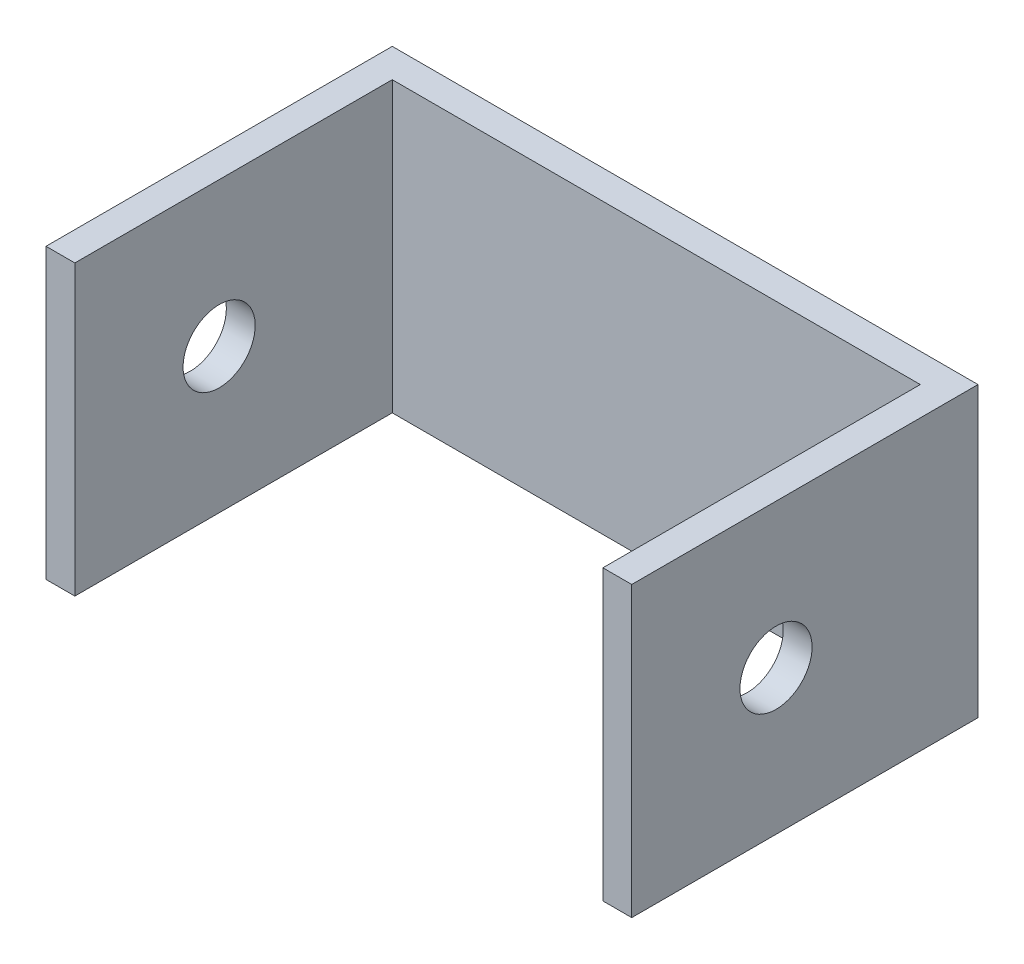
ISO-10303-21;
HEADER;
FILE_DESCRIPTION(('STEP AP214'),'2;1');
FILE_NAME('part.step','',(''),(''),'','','');
FILE_SCHEMA(('AUTOMOTIVE_DESIGN { 1 0 10303 214 1 1 1 1 }'));
ENDSEC;
DATA;
#1=APPLICATION_CONTEXT('core data for automotive mechanical design processes');
#2=APPLICATION_PROTOCOL_DEFINITION('international standard','automotive_design',2000,#1);
#3=PRODUCT_CONTEXT('',#1,'mechanical');
#4=PRODUCT('Part','Part','',(#3));
#5=PRODUCT_RELATED_PRODUCT_CATEGORY('part','',(#4));
#6=PRODUCT_DEFINITION_FORMATION('','',#4);
#7=PRODUCT_DEFINITION_CONTEXT('part definition',#1,'design');
#8=PRODUCT_DEFINITION('design','',#6,#7);
#9=PRODUCT_DEFINITION_SHAPE('','',#8);
#10=(LENGTH_UNIT() NAMED_UNIT(*) SI_UNIT(.MILLI.,.METRE.));
#11=(NAMED_UNIT(*) PLANE_ANGLE_UNIT() SI_UNIT($,.RADIAN.));
#12=(NAMED_UNIT(*) SI_UNIT($,.STERADIAN.) SOLID_ANGLE_UNIT());
#13=UNCERTAINTY_MEASURE_WITH_UNIT(LENGTH_MEASURE(1.E-05),#10,'distance_accuracy_value','');
#14=(GEOMETRIC_REPRESENTATION_CONTEXT(3) GLOBAL_UNCERTAINTY_ASSIGNED_CONTEXT((#13)) GLOBAL_UNIT_ASSIGNED_CONTEXT((#10,
#11,#12)) REPRESENTATION_CONTEXT('',''));
#15=CARTESIAN_POINT('',(0.,0.,0.));
#16=DIRECTION('',(0.,0.,1.));
#17=DIRECTION('',(1.,0.,0.));
#18=AXIS2_PLACEMENT_3D('',#15,#16,#17);
#19=CARTESIAN_POINT('',(0.,0.,2.));
#20=DIRECTION('',(0.,0.,1.));
#21=DIRECTION('',(1.,0.,0.));
#22=AXIS2_PLACEMENT_3D('',#19,#20,#21);
#23=PLANE('',#22);
#24=DIRECTION('',(1.,0.,0.));
#25=VECTOR('',#24,1.);
#26=CARTESIAN_POINT('',(-20.3,-10.,2.));
#27=LINE('',#26,#25);
#28=CARTESIAN_POINT('',(-18.3,-10.,2.));
#29=VERTEX_POINT('',#28);
#30=CARTESIAN_POINT('',(18.3,-10.,2.));
#31=VERTEX_POINT('',#30);
#32=EDGE_CURVE('E61',#29,#31,#27,.T.);
#33=ORIENTED_EDGE('',*,*,#32,.T.);
#34=DIRECTION('',(0.,-1.,0.));
#35=VECTOR('',#34,1.);
#36=CARTESIAN_POINT('',(18.3,10.,2.));
#37=LINE('',#36,#35);
#38=CARTESIAN_POINT('',(18.3,10.,2.));
#39=VERTEX_POINT('',#38);
#40=EDGE_CURVE('E56',#39,#31,#37,.T.);
#41=ORIENTED_EDGE('',*,*,#40,.F.);
#42=DIRECTION('',(-1.,0.,0.));
#43=VECTOR('',#42,1.);
#44=CARTESIAN_POINT('',(-20.3,10.,2.));
#45=LINE('',#44,#43);
#46=CARTESIAN_POINT('',(-18.3,10.,2.));
#47=VERTEX_POINT('',#46);
#48=EDGE_CURVE('E169',#39,#47,#45,.T.);
#49=ORIENTED_EDGE('',*,*,#48,.T.);
#50=DIRECTION('',(0.,1.,0.));
#51=VECTOR('',#50,1.);
#52=CARTESIAN_POINT('',(-18.3,10.,2.));
#53=LINE('',#52,#51);
#54=EDGE_CURVE('E143',#29,#47,#53,.T.);
#55=ORIENTED_EDGE('',*,*,#54,.F.);
#56=EDGE_LOOP('',(#33,#41,#49,#55));
#57=FACE_BOUND('',#56,.T.);
#58=ADVANCED_FACE('F39',(#57),#23,.T.);
#59=CARTESIAN_POINT('',(20.3,10.,2.));
#60=DIRECTION('',(-1.,0.,0.));
#61=DIRECTION('',(0.,0.,1.));
#62=AXIS2_PLACEMENT_3D('',#59,#60,#61);
#63=PLANE('',#62);
#64=CARTESIAN_POINT('',(20.3,0.,14.));
#65=DIRECTION('',(-1.,0.,0.));
#66=DIRECTION('',(0.,-1.,0.));
#67=AXIS2_PLACEMENT_3D('',#64,#65,#66);
#68=CIRCLE('',#67,2.5);
#69=CARTESIAN_POINT('',(20.3,-2.5,14.));
#70=VERTEX_POINT('',#69);
#71=EDGE_CURVE('E340',#70,#70,#68,.T.);
#72=ORIENTED_EDGE('',*,*,#71,.T.);
#73=EDGE_LOOP('',(#72));
#74=FACE_BOUND('',#73,.T.);
#75=DIRECTION('',(0.,1.,0.));
#76=VECTOR('',#75,1.);
#77=CARTESIAN_POINT('',(20.3,10.,0.));
#78=LINE('',#77,#76);
#79=CARTESIAN_POINT('',(20.3,-10.,0.));
#80=VERTEX_POINT('',#79);
#81=CARTESIAN_POINT('',(20.3,10.,0.));
#82=VERTEX_POINT('',#81);
#83=EDGE_CURVE('E109',#80,#82,#78,.T.);
#84=ORIENTED_EDGE('',*,*,#83,.T.);
#85=DIRECTION('',(0.,0.,-1.));
#86=VECTOR('',#85,1.);
#87=CARTESIAN_POINT('',(20.3,10.,2.));
#88=LINE('',#87,#86);
#89=CARTESIAN_POINT('',(20.3,10.,24.));
#90=VERTEX_POINT('',#89);
#91=EDGE_CURVE('E11',#90,#82,#88,.T.);
#92=ORIENTED_EDGE('',*,*,#91,.F.);
#93=DIRECTION('',(0.,1.,0.));
#94=VECTOR('',#93,1.);
#95=CARTESIAN_POINT('',(20.3,10.,24.));
#96=LINE('',#95,#94);
#97=CARTESIAN_POINT('',(20.3,-10.,24.));
#98=VERTEX_POINT('',#97);
#99=EDGE_CURVE('E107',#98,#90,#96,.T.);
#100=ORIENTED_EDGE('',*,*,#99,.F.);
#101=DIRECTION('',(0.,0.,-1.));
#102=VECTOR('',#101,1.);
#103=CARTESIAN_POINT('',(20.3,-10.,2.));
#104=LINE('',#103,#102);
#105=EDGE_CURVE('E175',#98,#80,#104,.T.);
#106=ORIENTED_EDGE('',*,*,#105,.T.);
#107=EDGE_LOOP('',(#84,#92,#100,#106));
#108=FACE_BOUND('',#107,.T.);
#109=ADVANCED_FACE('F41',(#74,#108),#63,.F.);
#110=CARTESIAN_POINT('',(-20.3,10.,2.));
#111=DIRECTION('',(0.,-1.,0.));
#112=DIRECTION('',(0.,0.,-1.));
#113=AXIS2_PLACEMENT_3D('',#110,#111,#112);
#114=PLANE('',#113);
#115=DIRECTION('',(-1.,0.,0.));
#116=VECTOR('',#115,1.);
#117=CARTESIAN_POINT('',(-20.3,10.,0.));
#118=LINE('',#117,#116);
#119=CARTESIAN_POINT('',(-20.3,10.,0.));
#120=VERTEX_POINT('',#119);
#121=EDGE_CURVE('E178',#82,#120,#118,.T.);
#122=ORIENTED_EDGE('',*,*,#121,.T.);
#123=DIRECTION('',(0.,0.,-1.));
#124=VECTOR('',#123,1.);
#125=CARTESIAN_POINT('',(-20.3,10.,2.));
#126=LINE('',#125,#124);
#127=CARTESIAN_POINT('',(-20.3,10.,24.));
#128=VERTEX_POINT('',#127);
#129=EDGE_CURVE('E49',#128,#120,#126,.T.);
#130=ORIENTED_EDGE('',*,*,#129,.F.);
#131=DIRECTION('',(-1.,0.,0.));
#132=VECTOR('',#131,1.);
#133=CARTESIAN_POINT('',(-20.3,10.,24.));
#134=LINE('',#133,#132);
#135=CARTESIAN_POINT('',(-18.3,10.,24.));
#136=VERTEX_POINT('',#135);
#137=EDGE_CURVE('E154',#136,#128,#134,.T.);
#138=ORIENTED_EDGE('',*,*,#137,.F.);
#139=DIRECTION('',(0.,0.,-1.));
#140=VECTOR('',#139,1.);
#141=CARTESIAN_POINT('',(-18.3,10.,24.));
#142=LINE('',#141,#140);
#143=EDGE_CURVE('E158',#136,#47,#142,.T.);
#144=ORIENTED_EDGE('',*,*,#143,.T.);
#145=ORIENTED_EDGE('',*,*,#48,.F.);
#146=DIRECTION('',(0.,0.,-1.));
#147=VECTOR('',#146,1.);
#148=CARTESIAN_POINT('',(18.3,10.,24.));
#149=LINE('',#148,#147);
#150=CARTESIAN_POINT('',(18.3,10.,24.));
#151=VERTEX_POINT('',#150);
#152=EDGE_CURVE('E115',#151,#39,#149,.T.);
#153=ORIENTED_EDGE('',*,*,#152,.F.);
#154=DIRECTION('',(-1.,0.,0.));
#155=VECTOR('',#154,1.);
#156=CARTESIAN_POINT('',(20.3,10.,24.));
#157=LINE('',#156,#155);
#158=EDGE_CURVE('E112',#90,#151,#157,.T.);
#159=ORIENTED_EDGE('',*,*,#158,.F.);
#160=ORIENTED_EDGE('',*,*,#91,.T.);
#161=EDGE_LOOP('',(#122,#130,#138,#144,#145,#153,#159,#160));
#162=FACE_BOUND('',#161,.T.);
#163=ADVANCED_FACE('F113',(#162),#114,.F.);
#164=CARTESIAN_POINT('',(-20.3,10.,2.));
#165=DIRECTION('',(1.,0.,0.));
#166=DIRECTION('',(0.,1.,0.));
#167=AXIS2_PLACEMENT_3D('',#164,#165,#166);
#168=PLANE('',#167);
#169=CARTESIAN_POINT('',(-20.3,0.,14.));
#170=DIRECTION('',(-1.,0.,0.));
#171=DIRECTION('',(0.,-1.,0.));
#172=AXIS2_PLACEMENT_3D('',#169,#170,#171);
#173=CIRCLE('',#172,2.5);
#174=CARTESIAN_POINT('',(-20.3,-2.5,14.));
#175=VERTEX_POINT('',#174);
#176=EDGE_CURVE('E335',#175,#175,#173,.T.);
#177=ORIENTED_EDGE('',*,*,#176,.F.);
#178=EDGE_LOOP('',(#177));
#179=FACE_BOUND('',#178,.T.);
#180=DIRECTION('',(0.,-1.,0.));
#181=VECTOR('',#180,1.);
#182=CARTESIAN_POINT('',(-20.3,10.,0.));
#183=LINE('',#182,#181);
#184=CARTESIAN_POINT('',(-20.3,-10.,0.));
#185=VERTEX_POINT('',#184);
#186=EDGE_CURVE('E181',#120,#185,#183,.T.);
#187=ORIENTED_EDGE('',*,*,#186,.T.);
#188=DIRECTION('',(0.,0.,-1.));
#189=VECTOR('',#188,1.);
#190=CARTESIAN_POINT('',(-20.3,-10.,2.));
#191=LINE('',#190,#189);
#192=CARTESIAN_POINT('',(-20.3,-10.,24.));
#193=VERTEX_POINT('',#192);
#194=EDGE_CURVE('E188',#193,#185,#191,.T.);
#195=ORIENTED_EDGE('',*,*,#194,.F.);
#196=DIRECTION('',(0.,-1.,0.));
#197=VECTOR('',#196,1.);
#198=CARTESIAN_POINT('',(-20.3,10.,24.));
#199=LINE('',#198,#197);
#200=EDGE_CURVE('E144',#128,#193,#199,.T.);
#201=ORIENTED_EDGE('',*,*,#200,.F.);
#202=ORIENTED_EDGE('',*,*,#129,.T.);
#203=EDGE_LOOP('',(#187,#195,#201,#202));
#204=FACE_BOUND('',#203,.T.);
#205=ADVANCED_FACE('F197',(#179,#204),#168,.F.);
#206=CARTESIAN_POINT('',(-20.3,-10.,2.));
#207=DIRECTION('',(0.,1.,0.));
#208=DIRECTION('',(0.,0.,1.));
#209=AXIS2_PLACEMENT_3D('',#206,#207,#208);
#210=PLANE('',#209);
#211=DIRECTION('',(1.,0.,0.));
#212=VECTOR('',#211,1.);
#213=CARTESIAN_POINT('',(-20.3,-10.,0.));
#214=LINE('',#213,#212);
#215=EDGE_CURVE('E172',#185,#80,#214,.T.);
#216=ORIENTED_EDGE('',*,*,#215,.T.);
#217=ORIENTED_EDGE('',*,*,#105,.F.);
#218=DIRECTION('',(1.,0.,0.));
#219=VECTOR('',#218,1.);
#220=CARTESIAN_POINT('',(20.3,-10.,24.));
#221=LINE('',#220,#219);
#222=CARTESIAN_POINT('',(18.3,-10.,24.));
#223=VERTEX_POINT('',#222);
#224=EDGE_CURVE('E124',#223,#98,#221,.T.);
#225=ORIENTED_EDGE('',*,*,#224,.F.);
#226=DIRECTION('',(0.,0.,-1.));
#227=VECTOR('',#226,1.);
#228=CARTESIAN_POINT('',(18.3,-10.,24.));
#229=LINE('',#228,#227);
#230=EDGE_CURVE('E136',#223,#31,#229,.T.);
#231=ORIENTED_EDGE('',*,*,#230,.T.);
#232=ORIENTED_EDGE('',*,*,#32,.F.);
#233=DIRECTION('',(0.,0.,-1.));
#234=VECTOR('',#233,1.);
#235=CARTESIAN_POINT('',(-18.3,-10.,24.));
#236=LINE('',#235,#234);
#237=CARTESIAN_POINT('',(-18.3,-10.,24.));
#238=VERTEX_POINT('',#237);
#239=EDGE_CURVE('E165',#238,#29,#236,.T.);
#240=ORIENTED_EDGE('',*,*,#239,.F.);
#241=DIRECTION('',(1.,0.,0.));
#242=VECTOR('',#241,1.);
#243=CARTESIAN_POINT('',(-20.3,-10.,24.));
#244=LINE('',#243,#242);
#245=EDGE_CURVE('E148',#193,#238,#244,.T.);
#246=ORIENTED_EDGE('',*,*,#245,.F.);
#247=ORIENTED_EDGE('',*,*,#194,.T.);
#248=EDGE_LOOP('',(#216,#217,#225,#231,#232,#240,#246,#247));
#249=FACE_BOUND('',#248,.T.);
#250=ADVANCED_FACE('F203',(#249),#210,.F.);
#251=CARTESIAN_POINT('',(0.,0.,0.));
#252=DIRECTION('',(0.,0.,1.));
#253=DIRECTION('',(1.,0.,0.));
#254=AXIS2_PLACEMENT_3D('',#251,#252,#253);
#255=PLANE('',#254);
#256=ORIENTED_EDGE('',*,*,#83,.F.);
#257=ORIENTED_EDGE('',*,*,#215,.F.);
#258=ORIENTED_EDGE('',*,*,#186,.F.);
#259=ORIENTED_EDGE('',*,*,#121,.F.);
#260=EDGE_LOOP('',(#256,#257,#258,#259));
#261=FACE_BOUND('',#260,.T.);
#262=ADVANCED_FACE('F201',(#261),#255,.F.);
#263=CARTESIAN_POINT('',(-18.3,10.,24.));
#264=DIRECTION('',(-1.,0.,0.));
#265=DIRECTION('',(0.,-1.,0.));
#266=AXIS2_PLACEMENT_3D('',#263,#264,#265);
#267=PLANE('',#266);
#268=CARTESIAN_POINT('',(-18.3,0.,14.));
#269=DIRECTION('',(-1.,0.,0.));
#270=DIRECTION('',(0.,-1.,0.));
#271=AXIS2_PLACEMENT_3D('',#268,#269,#270);
#272=CIRCLE('',#271,2.5);
#273=CARTESIAN_POINT('',(-18.3,-2.5,14.));
#274=VERTEX_POINT('',#273);
#275=EDGE_CURVE('E128',#274,#274,#272,.T.);
#276=ORIENTED_EDGE('',*,*,#275,.T.);
#277=EDGE_LOOP('',(#276));
#278=FACE_BOUND('',#277,.T.);
#279=ORIENTED_EDGE('',*,*,#54,.T.);
#280=ORIENTED_EDGE('',*,*,#143,.F.);
#281=DIRECTION('',(0.,1.,0.));
#282=VECTOR('',#281,1.);
#283=CARTESIAN_POINT('',(-18.3,10.,24.));
#284=LINE('',#283,#282);
#285=EDGE_CURVE('E151',#238,#136,#284,.T.);
#286=ORIENTED_EDGE('',*,*,#285,.F.);
#287=ORIENTED_EDGE('',*,*,#239,.T.);
#288=EDGE_LOOP('',(#279,#280,#286,#287));
#289=FACE_BOUND('',#288,.T.);
#290=ADVANCED_FACE('F211',(#278,#289),#267,.F.);
#291=CARTESIAN_POINT('',(0.,0.,24.));
#292=DIRECTION('',(0.,0.,1.));
#293=DIRECTION('',(1.,0.,0.));
#294=AXIS2_PLACEMENT_3D('',#291,#292,#293);
#295=PLANE('',#294);
#296=ORIENTED_EDGE('',*,*,#200,.T.);
#297=ORIENTED_EDGE('',*,*,#245,.T.);
#298=ORIENTED_EDGE('',*,*,#285,.T.);
#299=ORIENTED_EDGE('',*,*,#137,.T.);
#300=EDGE_LOOP('',(#296,#297,#298,#299));
#301=FACE_BOUND('',#300,.T.);
#302=ADVANCED_FACE('F208',(#301),#295,.T.);
#303=CARTESIAN_POINT('',(18.3,10.,24.));
#304=DIRECTION('',(1.,0.,0.));
#305=DIRECTION('',(0.,1.,0.));
#306=AXIS2_PLACEMENT_3D('',#303,#304,#305);
#307=PLANE('',#306);
#308=CARTESIAN_POINT('',(18.3,0.,14.));
#309=DIRECTION('',(1.,0.,0.));
#310=DIRECTION('',(0.,1.,0.));
#311=AXIS2_PLACEMENT_3D('',#308,#309,#310);
#312=CIRCLE('',#311,2.5);
#313=CARTESIAN_POINT('',(18.3,2.5,14.));
#314=VERTEX_POINT('',#313);
#315=EDGE_CURVE('E43',#314,#314,#312,.T.);
#316=ORIENTED_EDGE('',*,*,#315,.T.);
#317=EDGE_LOOP('',(#316));
#318=FACE_BOUND('',#317,.T.);
#319=ORIENTED_EDGE('',*,*,#40,.T.);
#320=ORIENTED_EDGE('',*,*,#230,.F.);
#321=DIRECTION('',(0.,-1.,0.));
#322=VECTOR('',#321,1.);
#323=CARTESIAN_POINT('',(18.3,10.,24.));
#324=LINE('',#323,#322);
#325=EDGE_CURVE('E119',#151,#223,#324,.T.);
#326=ORIENTED_EDGE('',*,*,#325,.F.);
#327=ORIENTED_EDGE('',*,*,#152,.T.);
#328=EDGE_LOOP('',(#319,#320,#326,#327));
#329=FACE_BOUND('',#328,.T.);
#330=ADVANCED_FACE('F214',(#318,#329),#307,.F.);
#331=CARTESIAN_POINT('',(0.,0.,24.));
#332=DIRECTION('',(0.,0.,-1.));
#333=DIRECTION('',(-1.,0.,0.));
#334=AXIS2_PLACEMENT_3D('',#331,#332,#333);
#335=PLANE('',#334);
#336=ORIENTED_EDGE('',*,*,#99,.T.);
#337=ORIENTED_EDGE('',*,*,#158,.T.);
#338=ORIENTED_EDGE('',*,*,#325,.T.);
#339=ORIENTED_EDGE('',*,*,#224,.T.);
#340=EDGE_LOOP('',(#336,#337,#338,#339));
#341=FACE_BOUND('',#340,.T.);
#342=ADVANCED_FACE('F122',(#341),#335,.F.);
#343=CARTESIAN_POINT('',(20.3,0.,14.));
#344=DIRECTION('',(-1.,0.,0.));
#345=DIRECTION('',(0.,-1.,0.));
#346=AXIS2_PLACEMENT_3D('',#343,#344,#345);
#347=CYLINDRICAL_SURFACE('',#346,2.5);
#348=ORIENTED_EDGE('',*,*,#71,.F.);
#349=EDGE_LOOP('',(#348));
#350=FACE_BOUND('',#349,.T.);
#351=ORIENTED_EDGE('',*,*,#315,.F.);
#352=EDGE_LOOP('',(#351));
#353=FACE_BOUND('',#352,.T.);
#354=ADVANCED_FACE('F222',(#350,#353),#347,.F.);
#355=ORIENTED_EDGE('',*,*,#176,.T.);
#356=EDGE_LOOP('',(#355));
#357=FACE_BOUND('',#356,.T.);
#358=ORIENTED_EDGE('',*,*,#275,.F.);
#359=EDGE_LOOP('',(#358));
#360=FACE_BOUND('',#359,.T.);
#361=ADVANCED_FACE('F319',(#357,#360),#347,.F.);
#362=CLOSED_SHELL('',(#58,#109,#163,#205,#250,#262,#290,#302,#330,#342,#354,#361));
#363=MANIFOLD_SOLID_BREP('B2',#362);
#364=ADVANCED_BREP_SHAPE_REPRESENTATION('',(#18,#363),#14);
#365=SHAPE_DEFINITION_REPRESENTATION(#9,#364);
ENDSEC;
END-ISO-10303-21;
